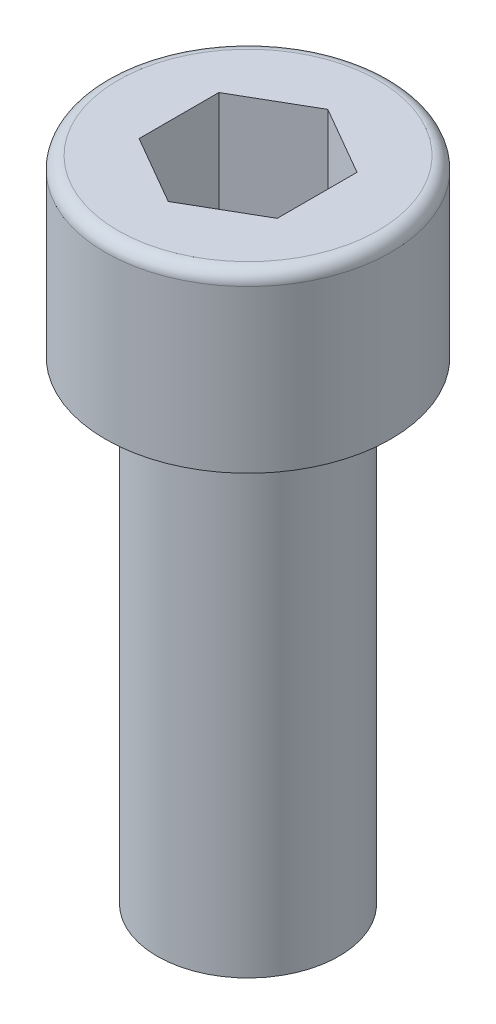
ISO-10303-21;
HEADER;
FILE_DESCRIPTION(('STEP AP214'),'2;1');
FILE_NAME('part.step','',(''),(''),'','','');
FILE_SCHEMA(('AUTOMOTIVE_DESIGN { 1 0 10303 214 1 1 1 1 }'));
ENDSEC;
DATA;
#1=APPLICATION_CONTEXT('core data for automotive mechanical design processes');
#2=APPLICATION_PROTOCOL_DEFINITION('international standard','automotive_design',2000,#1);
#3=PRODUCT_CONTEXT('',#1,'mechanical');
#4=PRODUCT('Part','Part','',(#3));
#5=PRODUCT_RELATED_PRODUCT_CATEGORY('part','',(#4));
#6=PRODUCT_DEFINITION_FORMATION('','',#4);
#7=PRODUCT_DEFINITION_CONTEXT('part definition',#1,'design');
#8=PRODUCT_DEFINITION('design','',#6,#7);
#9=PRODUCT_DEFINITION_SHAPE('','',#8);
#10=(LENGTH_UNIT() NAMED_UNIT(*) SI_UNIT(.MILLI.,.METRE.));
#11=(NAMED_UNIT(*) PLANE_ANGLE_UNIT() SI_UNIT($,.RADIAN.));
#12=(NAMED_UNIT(*) SI_UNIT($,.STERADIAN.) SOLID_ANGLE_UNIT());
#13=UNCERTAINTY_MEASURE_WITH_UNIT(LENGTH_MEASURE(1.E-05),#10,'distance_accuracy_value','');
#14=(GEOMETRIC_REPRESENTATION_CONTEXT(3) GLOBAL_UNCERTAINTY_ASSIGNED_CONTEXT((#13)) GLOBAL_UNIT_ASSIGNED_CONTEXT((#10,
#11,#12)) REPRESENTATION_CONTEXT('',''));
#15=CARTESIAN_POINT('',(0.,0.,0.));
#16=DIRECTION('',(0.,0.,1.));
#17=DIRECTION('',(1.,0.,0.));
#18=AXIS2_PLACEMENT_3D('',#15,#16,#17);
#19=CARTESIAN_POINT('',(0.,-9.525,0.));
#20=DIRECTION('',(0.,1.,0.));
#21=DIRECTION('',(0.,0.,1.));
#22=AXIS2_PLACEMENT_3D('',#19,#20,#21);
#23=CYLINDRICAL_SURFACE('',#22,1.8288);
#24=CARTESIAN_POINT('',(0.,-9.525,0.));
#25=DIRECTION('',(0.,1.,0.));
#26=DIRECTION('',(0.,0.,1.));
#27=AXIS2_PLACEMENT_3D('',#24,#25,#26);
#28=CIRCLE('',#27,1.8288);
#29=CARTESIAN_POINT('',(0.,-9.525,1.8288));
#30=VERTEX_POINT('',#29);
#31=EDGE_CURVE('E144',#30,#30,#28,.T.);
#32=CARTESIAN_POINT('',(0.,0.,0.));
#33=DIRECTION('',(0.,1.,0.));
#34=DIRECTION('',(0.,0.,1.));
#35=AXIS2_PLACEMENT_3D('',#32,#33,#34);
#36=CIRCLE('',#35,1.8288);
#37=CARTESIAN_POINT('',(0.,0.,1.8288));
#38=VERTEX_POINT('',#37);
#39=EDGE_CURVE('E143',#38,#38,#36,.T.);
#40=CARTESIAN_POINT('',(0.,-9.525,1.8288));
#41=CARTESIAN_POINT('',(0.,-9.42578125,1.8288));
#42=CARTESIAN_POINT('',(0.,-9.3265625,1.8288));
#43=CARTESIAN_POINT('',(0.,-9.128125,1.8288));
#44=CARTESIAN_POINT('',(0.,-9.02890625,1.8288));
#45=CARTESIAN_POINT('',(0.,-8.83046875,1.8288));
#46=CARTESIAN_POINT('',(0.,-8.73125,1.8288));
#47=CARTESIAN_POINT('',(0.,-8.5328125,1.8288));
#48=CARTESIAN_POINT('',(0.,-8.43359375,1.8288));
#49=CARTESIAN_POINT('',(0.,-8.23515625,1.8288));
#50=CARTESIAN_POINT('',(0.,-8.1359375,1.8288));
#51=CARTESIAN_POINT('',(0.,-7.9375,1.8288));
#52=CARTESIAN_POINT('',(0.,-7.83828125,1.8288));
#53=CARTESIAN_POINT('',(0.,-7.63984375,1.8288));
#54=CARTESIAN_POINT('',(0.,-7.540625,1.8288));
#55=CARTESIAN_POINT('',(0.,-7.3421875,1.8288));
#56=CARTESIAN_POINT('',(0.,-7.24296875,1.8288));
#57=CARTESIAN_POINT('',(0.,-7.04453125,1.8288));
#58=CARTESIAN_POINT('',(0.,-6.9453125,1.8288));
#59=CARTESIAN_POINT('',(0.,-6.746875,1.8288));
#60=CARTESIAN_POINT('',(0.,-6.64765625,1.8288));
#61=CARTESIAN_POINT('',(0.,-6.44921875,1.8288));
#62=CARTESIAN_POINT('',(0.,-6.35,1.8288));
#63=CARTESIAN_POINT('',(0.,-6.1515625,1.8288));
#64=CARTESIAN_POINT('',(0.,-6.05234375,1.8288));
#65=CARTESIAN_POINT('',(0.,-5.85390625,1.8288));
#66=CARTESIAN_POINT('',(0.,-5.7546875,1.8288));
#67=CARTESIAN_POINT('',(0.,-5.55625,1.8288));
#68=CARTESIAN_POINT('',(0.,-5.45703125,1.8288));
#69=CARTESIAN_POINT('',(0.,-5.25859375,1.8288));
#70=CARTESIAN_POINT('',(0.,-5.159375,1.8288));
#71=CARTESIAN_POINT('',(0.,-4.9609375,1.8288));
#72=CARTESIAN_POINT('',(0.,-4.86171875,1.8288));
#73=CARTESIAN_POINT('',(0.,-4.66328125,1.8288));
#74=CARTESIAN_POINT('',(0.,-4.5640625,1.8288));
#75=CARTESIAN_POINT('',(0.,-4.365625,1.8288));
#76=CARTESIAN_POINT('',(0.,-4.26640625,1.8288));
#77=CARTESIAN_POINT('',(0.,-4.06796875,1.8288));
#78=CARTESIAN_POINT('',(0.,-3.96875,1.8288));
#79=CARTESIAN_POINT('',(0.,-3.7703125,1.8288));
#80=CARTESIAN_POINT('',(0.,-3.67109375,1.8288));
#81=CARTESIAN_POINT('',(0.,-3.47265625,1.8288));
#82=CARTESIAN_POINT('',(0.,-3.3734375,1.8288));
#83=CARTESIAN_POINT('',(0.,-3.175,1.8288));
#84=CARTESIAN_POINT('',(0.,-3.07578125,1.8288));
#85=CARTESIAN_POINT('',(0.,-2.87734375,1.8288));
#86=CARTESIAN_POINT('',(0.,-2.778125,1.8288));
#87=CARTESIAN_POINT('',(0.,-2.5796875,1.8288));
#88=CARTESIAN_POINT('',(0.,-2.48046875,1.8288));
#89=CARTESIAN_POINT('',(0.,-2.28203125,1.8288));
#90=CARTESIAN_POINT('',(0.,-2.1828125,1.8288));
#91=CARTESIAN_POINT('',(0.,-1.984375,1.8288));
#92=CARTESIAN_POINT('',(0.,-1.88515625,1.8288));
#93=CARTESIAN_POINT('',(0.,-1.68671875,1.8288));
#94=CARTESIAN_POINT('',(0.,-1.5875,1.8288));
#95=CARTESIAN_POINT('',(0.,-1.3890625,1.8288));
#96=CARTESIAN_POINT('',(0.,-1.28984375,1.8288));
#97=CARTESIAN_POINT('',(0.,-1.09140625,1.8288));
#98=CARTESIAN_POINT('',(0.,-0.992187500000001,1.8288));
#99=CARTESIAN_POINT('',(0.,-0.793750000000001,1.8288));
#100=CARTESIAN_POINT('',(0.,-0.69453125,1.8288));
#101=CARTESIAN_POINT('',(0.,-0.49609375,1.8288));
#102=CARTESIAN_POINT('',(0.,-0.396875,1.8288));
#103=CARTESIAN_POINT('',(0.,-0.1984375,1.8288));
#104=CARTESIAN_POINT('',(0.,-0.0992187500000001,1.8288));
#105=CARTESIAN_POINT('',(0.,0.,1.8288));
#106=B_SPLINE_CURVE_WITH_KNOTS('',3,(#40,#41,#42,#43,#44,#45,#46,#47,#48,#49,#50,#51,#52,#53,
#54,#55,#56,#57,#58,#59,#60,#61,#62,#63,#64,#65,#66,#67,#68,#69,#70,#71,#72,#73,#74,#75,#76,#77,
#78,#79,#80,#81,#82,#83,#84,#85,#86,#87,#88,#89,#90,#91,#92,#93,#94,#95,#96,#97,#98,#99,#100,
#101,#102,#103,#104,#105),.UNSPECIFIED.,.F.,.F.,(4,2,2,2,2,2,2,2,2,2,2,2,2,2,2,2,2,2,2,2,2,2,2,
2,2,2,2,2,2,2,2,2,4),(0.,0.29765625,0.5953125,0.892968750000001,1.190625,1.48828125,1.7859375,
2.08359375,2.38125,2.67890625,2.9765625,3.27421875,3.571875,3.86953125,4.1671875,4.46484375,
4.7625,5.06015625,5.3578125,5.65546875,5.953125,6.25078125,6.5484375,6.84609375,7.14375,
7.44140625,7.7390625,8.03671875,8.334375,8.63203125,8.9296875,9.22734375,9.525),.UNSPECIFIED.);
#107=EDGE_CURVE('BSEAM33',#30,#38,#106,.T.);
#108=ORIENTED_EDGE('',*,*,#31,.T.);
#109=ORIENTED_EDGE('',*,*,#39,.F.);
#110=ORIENTED_EDGE('',*,*,#107,.T.);
#111=ORIENTED_EDGE('',*,*,#107,.F.);
#112=EDGE_LOOP('',(#108,#110,#109,#111));
#113=FACE_BOUND('',#112,.T.);
#114=ADVANCED_FACE('F33',(#113),#23,.T.);
#115=CARTESIAN_POINT('',(0.,-9.525,0.));
#116=DIRECTION('',(0.,1.,0.));
#117=DIRECTION('',(0.,0.,1.));
#118=AXIS2_PLACEMENT_3D('',#115,#116,#117);
#119=PLANE('',#118);
#120=ORIENTED_EDGE('',*,*,#31,.F.);
#121=EDGE_LOOP('',(#120));
#122=FACE_BOUND('',#121,.T.);
#123=ADVANCED_FACE('F167',(#122),#119,.F.);
#124=CARTESIAN_POINT('',(0.,3.5052,0.));
#125=DIRECTION('',(0.,-1.,0.));
#126=DIRECTION('',(0.,0.,-1.));
#127=AXIS2_PLACEMENT_3D('',#124,#125,#126);
#128=CYLINDRICAL_SURFACE('',#127,2.8702);
#129=CARTESIAN_POINT('',(0.,3.2512,0.));
#130=DIRECTION('',(0.,1.,0.));
#131=DIRECTION('',(0.,0.,1.));
#132=AXIS2_PLACEMENT_3D('',#129,#130,#131);
#133=CIRCLE('',#132,2.8702);
#134=CARTESIAN_POINT('',(0.,3.2512,2.8702));
#135=VERTEX_POINT('',#134);
#136=EDGE_CURVE('E11',#135,#135,#133,.F.);
#137=ORIENTED_EDGE('',*,*,#136,.T.);
#138=EDGE_LOOP('',(#137));
#139=FACE_BOUND('',#138,.T.);
#140=CARTESIAN_POINT('',(0.,0.,0.));
#141=DIRECTION('',(0.,1.,0.));
#142=DIRECTION('',(0.,0.,1.));
#143=AXIS2_PLACEMENT_3D('',#140,#141,#142);
#144=CIRCLE('',#143,2.8702);
#145=CARTESIAN_POINT('',(0.,0.,2.8702));
#146=VERTEX_POINT('',#145);
#147=EDGE_CURVE('E135',#146,#146,#144,.T.);
#148=ORIENTED_EDGE('',*,*,#147,.T.);
#149=EDGE_LOOP('',(#148));
#150=FACE_BOUND('',#149,.T.);
#151=ADVANCED_FACE('F172',(#139,#150),#128,.T.);
#152=CARTESIAN_POINT('',(0.,3.5052,0.));
#153=DIRECTION('',(0.,1.,0.));
#154=DIRECTION('',(0.,0.,1.));
#155=AXIS2_PLACEMENT_3D('',#152,#153,#154);
#156=PLANE('',#155);
#157=DIRECTION('',(-0.866025403784439,0.,-0.5));
#158=VECTOR('',#157,1.);
#159=CARTESIAN_POINT('',(1.3890625,3.5052,-0.801975608296215));
#160=LINE('',#159,#158);
#161=CARTESIAN_POINT('',(1.3890625,3.5052,-0.801975608296215));
#162=VERTEX_POINT('',#161);
#163=CARTESIAN_POINT('',(0.,3.5052,-1.60395121659243));
#164=VERTEX_POINT('',#163);
#165=EDGE_CURVE('E48',#162,#164,#160,.T.);
#166=ORIENTED_EDGE('',*,*,#165,.F.);
#167=DIRECTION('',(0.,0.,-1.));
#168=VECTOR('',#167,1.);
#169=CARTESIAN_POINT('',(1.3890625,3.5052,0.801975608296215));
#170=LINE('',#169,#168);
#171=CARTESIAN_POINT('',(1.3890625,3.5052,0.801975608296215));
#172=VERTEX_POINT('',#171);
#173=EDGE_CURVE('E131',#172,#162,#170,.T.);
#174=ORIENTED_EDGE('',*,*,#173,.F.);
#175=DIRECTION('',(0.866025403784439,0.,-0.5));
#176=VECTOR('',#175,1.);
#177=CARTESIAN_POINT('',(0.,3.5052,1.60395121659243));
#178=LINE('',#177,#176);
#179=CARTESIAN_POINT('',(0.,3.5052,1.60395121659243));
#180=VERTEX_POINT('',#179);
#181=EDGE_CURVE('E129',#180,#172,#178,.T.);
#182=ORIENTED_EDGE('',*,*,#181,.F.);
#183=DIRECTION('',(0.866025403784439,0.,0.5));
#184=VECTOR('',#183,1.);
#185=CARTESIAN_POINT('',(-1.3890625,3.5052,0.801975608296215));
#186=LINE('',#185,#184);
#187=CARTESIAN_POINT('',(-1.3890625,3.5052,0.801975608296215));
#188=VERTEX_POINT('',#187);
#189=EDGE_CURVE('E96',#188,#180,#186,.T.);
#190=ORIENTED_EDGE('',*,*,#189,.F.);
#191=DIRECTION('',(0.,0.,1.));
#192=VECTOR('',#191,1.);
#193=CARTESIAN_POINT('',(-1.3890625,3.5052,-0.801975608296215));
#194=LINE('',#193,#192);
#195=CARTESIAN_POINT('',(-1.3890625,3.5052,-0.801975608296215));
#196=VERTEX_POINT('',#195);
#197=EDGE_CURVE('E125',#196,#188,#194,.T.);
#198=ORIENTED_EDGE('',*,*,#197,.F.);
#199=DIRECTION('',(-0.866025403784439,0.,0.5));
#200=VECTOR('',#199,1.);
#201=CARTESIAN_POINT('',(0.,3.5052,-1.60395121659243));
#202=LINE('',#201,#200);
#203=EDGE_CURVE('E122',#164,#196,#202,.T.);
#204=ORIENTED_EDGE('',*,*,#203,.F.);
#205=EDGE_LOOP('',(#166,#174,#182,#190,#198,#204));
#206=FACE_BOUND('',#205,.T.);
#207=CARTESIAN_POINT('',(0.,3.5052,0.));
#208=DIRECTION('',(0.,1.,0.));
#209=DIRECTION('',(0.,0.,1.));
#210=AXIS2_PLACEMENT_3D('',#207,#208,#209);
#211=CIRCLE('',#210,2.6162);
#212=CARTESIAN_POINT('',(0.,3.5052,2.6162));
#213=VERTEX_POINT('',#212);
#214=EDGE_CURVE('E41',#213,#213,#211,.T.);
#215=ORIENTED_EDGE('',*,*,#214,.T.);
#216=EDGE_LOOP('',(#215));
#217=FACE_BOUND('',#216,.T.);
#218=ADVANCED_FACE('F151',(#206,#217),#156,.T.);
#219=CARTESIAN_POINT('',(0.,0.,0.));
#220=DIRECTION('',(0.,1.,0.));
#221=DIRECTION('',(0.,0.,1.));
#222=AXIS2_PLACEMENT_3D('',#219,#220,#221);
#223=PLANE('',#222);
#224=ORIENTED_EDGE('',*,*,#39,.T.);
#225=EDGE_LOOP('',(#224));
#226=FACE_BOUND('',#225,.T.);
#227=ORIENTED_EDGE('',*,*,#147,.F.);
#228=EDGE_LOOP('',(#227));
#229=FACE_BOUND('',#228,.T.);
#230=ADVANCED_FACE('F155',(#226,#229),#223,.F.);
#231=CARTESIAN_POINT('',(0.,3.2512,0.));
#232=DIRECTION('',(0.,1.,0.));
#233=DIRECTION('',(0.,0.,1.));
#234=AXIS2_PLACEMENT_3D('',#231,#232,#233);
#235=TOROIDAL_SURFACE('',#234,2.6162,0.254);
#236=ORIENTED_EDGE('',*,*,#136,.F.);
#237=EDGE_LOOP('',(#236));
#238=FACE_BOUND('',#237,.T.);
#239=ORIENTED_EDGE('',*,*,#214,.F.);
#240=EDGE_LOOP('',(#239));
#241=FACE_BOUND('',#240,.T.);
#242=ADVANCED_FACE('F35',(#238,#241),#235,.T.);
#243=CARTESIAN_POINT('',(1.3890625,0.9652,-0.801975608296215));
#244=DIRECTION('',(0.5,0.,-0.866025403784439));
#245=DIRECTION('',(-0.866025403784439,0.,-0.5));
#246=AXIS2_PLACEMENT_3D('',#243,#244,#245);
#247=PLANE('',#246);
#248=ORIENTED_EDGE('',*,*,#165,.T.);
#249=DIRECTION('',(0.,1.,0.));
#250=VECTOR('',#249,1.);
#251=CARTESIAN_POINT('',(0.,0.9652,-1.60395121659243));
#252=LINE('',#251,#250);
#253=CARTESIAN_POINT('',(0.,0.9652,-1.60395121659243));
#254=VERTEX_POINT('',#253);
#255=EDGE_CURVE('E78',#254,#164,#252,.T.);
#256=ORIENTED_EDGE('',*,*,#255,.F.);
#257=DIRECTION('',(-0.866025403784439,0.,-0.5));
#258=VECTOR('',#257,1.);
#259=CARTESIAN_POINT('',(1.3890625,0.9652,-0.801975608296215));
#260=LINE('',#259,#258);
#261=CARTESIAN_POINT('',(1.3890625,0.9652,-0.801975608296215));
#262=VERTEX_POINT('',#261);
#263=EDGE_CURVE('E133',#262,#254,#260,.T.);
#264=ORIENTED_EDGE('',*,*,#263,.F.);
#265=DIRECTION('',(0.,1.,0.));
#266=VECTOR('',#265,1.);
#267=CARTESIAN_POINT('',(1.3890625,0.9652,-0.801975608296215));
#268=LINE('',#267,#266);
#269=EDGE_CURVE('E56',#262,#162,#268,.T.);
#270=ORIENTED_EDGE('',*,*,#269,.T.);
#271=EDGE_LOOP('',(#248,#256,#264,#270));
#272=FACE_BOUND('',#271,.T.);
#273=ADVANCED_FACE('F154',(#272),#247,.F.);
#274=CARTESIAN_POINT('',(1.3890625,0.9652,0.801975608296215));
#275=DIRECTION('',(1.,0.,0.));
#276=DIRECTION('',(0.,0.,-1.));
#277=AXIS2_PLACEMENT_3D('',#274,#275,#276);
#278=PLANE('',#277);
#279=ORIENTED_EDGE('',*,*,#173,.T.);
#280=ORIENTED_EDGE('',*,*,#269,.F.);
#281=DIRECTION('',(0.,0.,-1.));
#282=VECTOR('',#281,1.);
#283=CARTESIAN_POINT('',(1.3890625,0.9652,0.801975608296215));
#284=LINE('',#283,#282);
#285=CARTESIAN_POINT('',(1.3890625,0.9652,0.801975608296215));
#286=VERTEX_POINT('',#285);
#287=EDGE_CURVE('E108',#286,#262,#284,.T.);
#288=ORIENTED_EDGE('',*,*,#287,.F.);
#289=DIRECTION('',(0.,1.,0.));
#290=VECTOR('',#289,1.);
#291=CARTESIAN_POINT('',(1.3890625,0.9652,0.801975608296215));
#292=LINE('',#291,#290);
#293=EDGE_CURVE('E100',#286,#172,#292,.T.);
#294=ORIENTED_EDGE('',*,*,#293,.T.);
#295=EDGE_LOOP('',(#279,#280,#288,#294));
#296=FACE_BOUND('',#295,.T.);
#297=ADVANCED_FACE('F161',(#296),#278,.F.);
#298=CARTESIAN_POINT('',(0.,0.9652,1.60395121659243));
#299=DIRECTION('',(0.5,0.,0.866025403784439));
#300=DIRECTION('',(0.866025403784439,0.,-0.5));
#301=AXIS2_PLACEMENT_3D('',#298,#299,#300);
#302=PLANE('',#301);
#303=ORIENTED_EDGE('',*,*,#181,.T.);
#304=ORIENTED_EDGE('',*,*,#293,.F.);
#305=DIRECTION('',(0.866025403784439,0.,-0.5));
#306=VECTOR('',#305,1.);
#307=CARTESIAN_POINT('',(0.,0.9652,1.60395121659243));
#308=LINE('',#307,#306);
#309=CARTESIAN_POINT('',(0.,0.9652,1.60395121659243));
#310=VERTEX_POINT('',#309);
#311=EDGE_CURVE('E104',#310,#286,#308,.T.);
#312=ORIENTED_EDGE('',*,*,#311,.F.);
#313=DIRECTION('',(0.,1.,0.));
#314=VECTOR('',#313,1.);
#315=CARTESIAN_POINT('',(0.,0.9652,1.60395121659243));
#316=LINE('',#315,#314);
#317=EDGE_CURVE('E89',#310,#180,#316,.T.);
#318=ORIENTED_EDGE('',*,*,#317,.T.);
#319=EDGE_LOOP('',(#303,#304,#312,#318));
#320=FACE_BOUND('',#319,.T.);
#321=ADVANCED_FACE('F105',(#320),#302,.F.);
#322=CARTESIAN_POINT('',(-1.3890625,0.9652,0.801975608296215));
#323=DIRECTION('',(-0.5,0.,0.866025403784439));
#324=DIRECTION('',(0.866025403784439,0.,0.5));
#325=AXIS2_PLACEMENT_3D('',#322,#323,#324);
#326=PLANE('',#325);
#327=ORIENTED_EDGE('',*,*,#189,.T.);
#328=ORIENTED_EDGE('',*,*,#317,.F.);
#329=DIRECTION('',(0.866025403784439,0.,0.5));
#330=VECTOR('',#329,1.);
#331=CARTESIAN_POINT('',(-1.3890625,0.9652,0.801975608296215));
#332=LINE('',#331,#330);
#333=CARTESIAN_POINT('',(-1.3890625,0.9652,0.801975608296215));
#334=VERTEX_POINT('',#333);
#335=EDGE_CURVE('E93',#334,#310,#332,.T.);
#336=ORIENTED_EDGE('',*,*,#335,.F.);
#337=DIRECTION('',(0.,1.,0.));
#338=VECTOR('',#337,1.);
#339=CARTESIAN_POINT('',(-1.3890625,0.9652,0.801975608296215));
#340=LINE('',#339,#338);
#341=EDGE_CURVE('E101',#334,#188,#340,.T.);
#342=ORIENTED_EDGE('',*,*,#341,.T.);
#343=EDGE_LOOP('',(#327,#328,#336,#342));
#344=FACE_BOUND('',#343,.T.);
#345=ADVANCED_FACE('F91',(#344),#326,.F.);
#346=CARTESIAN_POINT('',(-1.3890625,0.9652,-0.801975608296215));
#347=DIRECTION('',(-1.,0.,0.));
#348=DIRECTION('',(0.,0.,1.));
#349=AXIS2_PLACEMENT_3D('',#346,#347,#348);
#350=PLANE('',#349);
#351=ORIENTED_EDGE('',*,*,#197,.T.);
#352=ORIENTED_EDGE('',*,*,#341,.F.);
#353=DIRECTION('',(0.,0.,1.));
#354=VECTOR('',#353,1.);
#355=CARTESIAN_POINT('',(-1.3890625,0.9652,-0.801975608296215));
#356=LINE('',#355,#354);
#357=CARTESIAN_POINT('',(-1.3890625,0.9652,-0.801975608296215));
#358=VERTEX_POINT('',#357);
#359=EDGE_CURVE('E114',#358,#334,#356,.T.);
#360=ORIENTED_EDGE('',*,*,#359,.F.);
#361=DIRECTION('',(0.,1.,0.));
#362=VECTOR('',#361,1.);
#363=CARTESIAN_POINT('',(-1.3890625,0.9652,-0.801975608296215));
#364=LINE('',#363,#362);
#365=EDGE_CURVE('E138',#358,#196,#364,.T.);
#366=ORIENTED_EDGE('',*,*,#365,.T.);
#367=EDGE_LOOP('',(#351,#352,#360,#366));
#368=FACE_BOUND('',#367,.T.);
#369=ADVANCED_FACE('F186',(#368),#350,.F.);
#370=CARTESIAN_POINT('',(0.,0.9652,-1.60395121659243));
#371=DIRECTION('',(-0.5,0.,-0.866025403784439));
#372=DIRECTION('',(-0.866025403784439,0.,0.5));
#373=AXIS2_PLACEMENT_3D('',#370,#371,#372);
#374=PLANE('',#373);
#375=ORIENTED_EDGE('',*,*,#203,.T.);
#376=ORIENTED_EDGE('',*,*,#365,.F.);
#377=DIRECTION('',(-0.866025403784439,0.,0.5));
#378=VECTOR('',#377,1.);
#379=CARTESIAN_POINT('',(0.,0.9652,-1.60395121659243));
#380=LINE('',#379,#378);
#381=EDGE_CURVE('E116',#254,#358,#380,.T.);
#382=ORIENTED_EDGE('',*,*,#381,.F.);
#383=ORIENTED_EDGE('',*,*,#255,.T.);
#384=EDGE_LOOP('',(#375,#376,#382,#383));
#385=FACE_BOUND('',#384,.T.);
#386=ADVANCED_FACE('F183',(#385),#374,.F.);
#387=CARTESIAN_POINT('',(0.,0.9652,0.));
#388=DIRECTION('',(0.,1.,0.));
#389=DIRECTION('',(0.,0.,1.));
#390=AXIS2_PLACEMENT_3D('',#387,#388,#389);
#391=PLANE('',#390);
#392=ORIENTED_EDGE('',*,*,#263,.T.);
#393=ORIENTED_EDGE('',*,*,#381,.T.);
#394=ORIENTED_EDGE('',*,*,#359,.T.);
#395=ORIENTED_EDGE('',*,*,#335,.T.);
#396=ORIENTED_EDGE('',*,*,#311,.T.);
#397=ORIENTED_EDGE('',*,*,#287,.T.);
#398=EDGE_LOOP('',(#392,#393,#394,#395,#396,#397));
#399=FACE_BOUND('',#398,.T.);
#400=ADVANCED_FACE('F111',(#399),#391,.T.);
#401=CLOSED_SHELL('',(#114,#123,#151,#218,#230,#242,#273,#297,#321,#345,#369,#386,#400));
#402=MANIFOLD_SOLID_BREP('B2',#401);
#403=ADVANCED_BREP_SHAPE_REPRESENTATION('',(#18,#402),#14);
#404=SHAPE_DEFINITION_REPRESENTATION(#9,#403);
ENDSEC;
END-ISO-10303-21;
